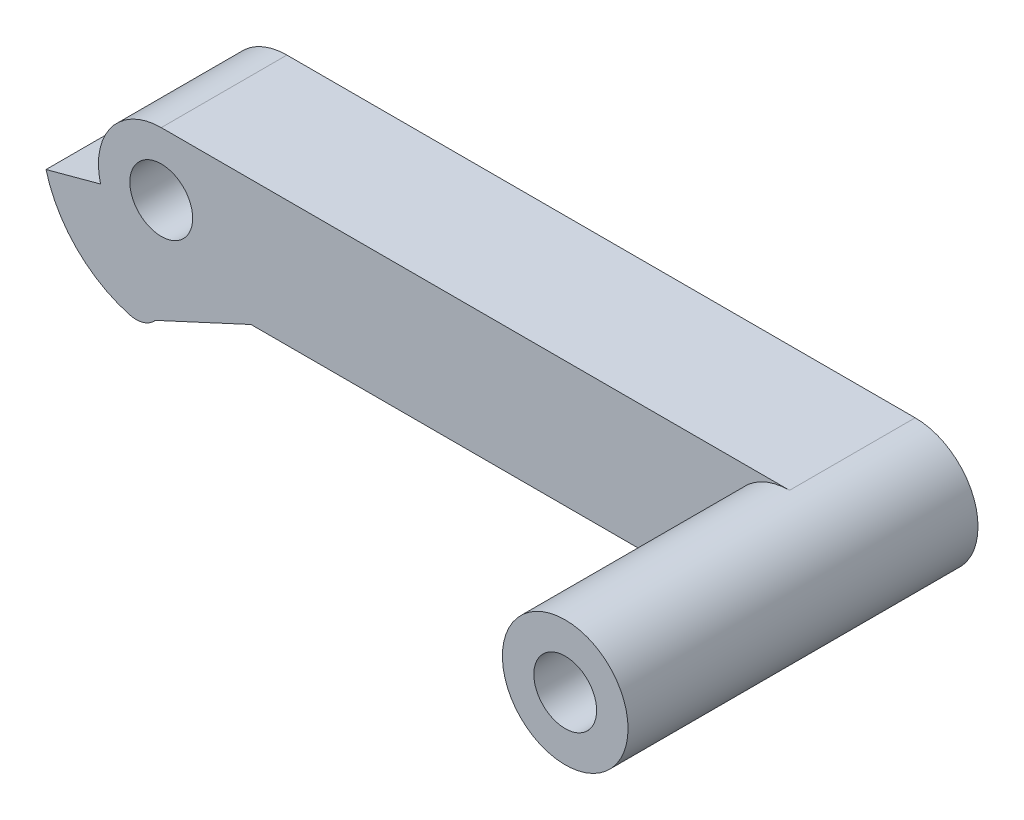
ISO-10303-21;
HEADER;
FILE_DESCRIPTION(('STEP AP214'),'2;1');
FILE_NAME('part.step','',(''),(''),'','','');
FILE_SCHEMA(('AUTOMOTIVE_DESIGN { 1 0 10303 214 1 1 1 1 }'));
ENDSEC;
DATA;
#1=APPLICATION_CONTEXT('core data for automotive mechanical design processes');
#2=APPLICATION_PROTOCOL_DEFINITION('international standard','automotive_design',2000,#1);
#3=PRODUCT_CONTEXT('',#1,'mechanical');
#4=PRODUCT('Part','Part','',(#3));
#5=PRODUCT_RELATED_PRODUCT_CATEGORY('part','',(#4));
#6=PRODUCT_DEFINITION_FORMATION('','',#4);
#7=PRODUCT_DEFINITION_CONTEXT('part definition',#1,'design');
#8=PRODUCT_DEFINITION('design','',#6,#7);
#9=PRODUCT_DEFINITION_SHAPE('','',#8);
#10=(LENGTH_UNIT() NAMED_UNIT(*) SI_UNIT(.MILLI.,.METRE.));
#11=(NAMED_UNIT(*) PLANE_ANGLE_UNIT() SI_UNIT($,.RADIAN.));
#12=(NAMED_UNIT(*) SI_UNIT($,.STERADIAN.) SOLID_ANGLE_UNIT());
#13=UNCERTAINTY_MEASURE_WITH_UNIT(LENGTH_MEASURE(1.E-05),#10,'distance_accuracy_value','');
#14=(GEOMETRIC_REPRESENTATION_CONTEXT(3) GLOBAL_UNCERTAINTY_ASSIGNED_CONTEXT((#13)) GLOBAL_UNIT_ASSIGNED_CONTEXT((#10,
#11,#12)) REPRESENTATION_CONTEXT('',''));
#15=CARTESIAN_POINT('',(0.,0.,0.));
#16=DIRECTION('',(0.,0.,1.));
#17=DIRECTION('',(1.,0.,0.));
#18=AXIS2_PLACEMENT_3D('',#15,#16,#17);
#19=CARTESIAN_POINT('',(0.,0.,-12.3012954674884));
#20=DIRECTION('',(0.,0.,1.));
#21=DIRECTION('',(1.,0.,0.));
#22=AXIS2_PLACEMENT_3D('',#19,#20,#21);
#23=CYLINDRICAL_SURFACE('',#22,9.5);
#24=CARTESIAN_POINT('',(0.,0.,10.));
#25=DIRECTION('',(0.,0.,1.));
#26=DIRECTION('',(1.,0.,0.));
#27=AXIS2_PLACEMENT_3D('',#24,#25,#26);
#28=CIRCLE('',#27,9.5);
#29=CARTESIAN_POINT('',(-9.17194693313327,-2.47495241485308,10.));
#30=VERTEX_POINT('',#29);
#31=CARTESIAN_POINT('',(-2.53333333333323,-9.1559937867073,10.));
#32=VERTEX_POINT('',#31);
#33=EDGE_CURVE('E121',#30,#32,#28,.T.);
#34=ORIENTED_EDGE('',*,*,#33,.F.);
#35=DIRECTION('',(0.,0.,1.));
#36=VECTOR('',#35,1.);
#37=CARTESIAN_POINT('',(-9.17194693313327,-2.47495241485308,-12.3012954674884));
#38=LINE('',#37,#36);
#39=CARTESIAN_POINT('',(-9.17194693313327,-2.47495241485308,0.));
#40=VERTEX_POINT('',#39);
#41=EDGE_CURVE('E106',#40,#30,#38,.T.);
#42=ORIENTED_EDGE('',*,*,#41,.F.);
#43=CARTESIAN_POINT('',(0.,0.,0.));
#44=DIRECTION('',(0.,0.,1.));
#45=DIRECTION('',(1.,0.,0.));
#46=AXIS2_PLACEMENT_3D('',#43,#44,#45);
#47=CIRCLE('',#46,9.5);
#48=CARTESIAN_POINT('',(-2.53333333333323,-9.1559937867073,0.));
#49=VERTEX_POINT('',#48);
#50=EDGE_CURVE('E116',#49,#40,#47,.F.);
#51=ORIENTED_EDGE('',*,*,#50,.F.);
#52=DIRECTION('',(0.,0.,1.));
#53=VECTOR('',#52,1.);
#54=CARTESIAN_POINT('',(-2.53333333333324,-9.1559937867073,-12.3012954674884));
#55=LINE('',#54,#53);
#56=EDGE_CURVE('E123',#49,#32,#55,.T.);
#57=ORIENTED_EDGE('',*,*,#56,.T.);
#58=EDGE_LOOP('',(#34,#42,#51,#57));
#59=FACE_BOUND('',#58,.T.);
#60=ADVANCED_FACE('F41',(#59),#23,.T.);
#61=CARTESIAN_POINT('',(0.,-5.,10.));
#62=DIRECTION('',(0.,1.,0.));
#63=DIRECTION('',(-1.,0.,0.));
#64=AXIS2_PLACEMENT_3D('',#61,#62,#63);
#65=PLANE('',#64);
#66=DIRECTION('',(1.,0.,0.));
#67=VECTOR('',#66,1.);
#68=CARTESIAN_POINT('',(0.,-5.,10.));
#69=LINE('',#68,#67);
#70=CARTESIAN_POINT('',(7.14343941971596,-5.,10.));
#71=VERTEX_POINT('',#70);
#72=CARTESIAN_POINT('',(50.,-5.,10.));
#73=VERTEX_POINT('',#72);
#74=EDGE_CURVE('E161',#71,#73,#69,.T.);
#75=ORIENTED_EDGE('',*,*,#74,.F.);
#76=DIRECTION('',(0.,0.,-1.));
#77=VECTOR('',#76,1.);
#78=CARTESIAN_POINT('',(7.14343941971596,-5.,10.));
#79=LINE('',#78,#77);
#80=CARTESIAN_POINT('',(7.14343941971596,-5.,0.));
#81=VERTEX_POINT('',#80);
#82=EDGE_CURVE('E187',#71,#81,#79,.T.);
#83=ORIENTED_EDGE('',*,*,#82,.T.);
#84=DIRECTION('',(1.,0.,0.));
#85=VECTOR('',#84,1.);
#86=CARTESIAN_POINT('',(0.,-5.,0.));
#87=LINE('',#86,#85);
#88=CARTESIAN_POINT('',(50.,-5.,0.));
#89=VERTEX_POINT('',#88);
#90=EDGE_CURVE('E152',#81,#89,#87,.T.);
#91=ORIENTED_EDGE('',*,*,#90,.T.);
#92=DIRECTION('',(0.,0.,-1.));
#93=VECTOR('',#92,1.);
#94=CARTESIAN_POINT('',(50.,-5.,10.));
#95=LINE('',#94,#93);
#96=EDGE_CURVE('E179',#73,#89,#95,.T.);
#97=ORIENTED_EDGE('',*,*,#96,.F.);
#98=EDGE_LOOP('',(#75,#83,#91,#97));
#99=FACE_BOUND('',#98,.T.);
#100=ADVANCED_FACE('F194',(#99),#65,.F.);
#101=CARTESIAN_POINT('',(50.,0.,10.));
#102=DIRECTION('',(0.,0.,-1.));
#103=DIRECTION('',(-1.,0.,0.));
#104=AXIS2_PLACEMENT_3D('',#101,#102,#103);
#105=CYLINDRICAL_SURFACE('',#104,5.);
#106=CARTESIAN_POINT('',(50.,0.,0.));
#107=DIRECTION('',(0.,0.,1.));
#108=DIRECTION('',(1.,0.,0.));
#109=AXIS2_PLACEMENT_3D('',#106,#107,#108);
#110=CIRCLE('',#109,5.);
#111=CARTESIAN_POINT('',(50.,5.,0.));
#112=VERTEX_POINT('',#111);
#113=EDGE_CURVE('E169',#89,#112,#110,.T.);
#114=ORIENTED_EDGE('',*,*,#113,.T.);
#115=DIRECTION('',(0.,0.,-1.));
#116=VECTOR('',#115,1.);
#117=CARTESIAN_POINT('',(50.,5.,10.));
#118=LINE('',#117,#116);
#119=CARTESIAN_POINT('',(50.,5.,10.));
#120=VERTEX_POINT('',#119);
#121=EDGE_CURVE('E177',#120,#112,#118,.T.);
#122=ORIENTED_EDGE('',*,*,#121,.F.);
#123=CARTESIAN_POINT('',(50.,0.,10.));
#124=DIRECTION('',(0.,0.,1.));
#125=DIRECTION('',(1.,0.,0.));
#126=AXIS2_PLACEMENT_3D('',#123,#124,#125);
#127=CIRCLE('',#126,5.);
#128=EDGE_CURVE('E142',#120,#73,#127,.T.);
#129=ORIENTED_EDGE('',*,*,#128,.T.);
#130=ORIENTED_EDGE('',*,*,#96,.T.);
#131=EDGE_LOOP('',(#114,#122,#129,#130));
#132=FACE_BOUND('',#131,.T.);
#133=CARTESIAN_POINT('',(50.,0.,27.85));
#134=DIRECTION('',(0.,0.,1.));
#135=DIRECTION('',(1.,0.,0.));
#136=AXIS2_PLACEMENT_3D('',#133,#134,#135);
#137=CIRCLE('',#136,5.);
#138=CARTESIAN_POINT('',(55.,0.,27.85));
#139=VERTEX_POINT('',#138);
#140=EDGE_CURVE('E143',#139,#139,#137,.T.);
#141=ORIENTED_EDGE('',*,*,#140,.F.);
#142=EDGE_LOOP('',(#141));
#143=FACE_BOUND('',#142,.T.);
#144=ADVANCED_FACE('F204',(#132,#143),#105,.T.);
#145=CARTESIAN_POINT('',(0.,5.,10.));
#146=DIRECTION('',(0.,1.,0.));
#147=DIRECTION('',(-1.,0.,0.));
#148=AXIS2_PLACEMENT_3D('',#145,#146,#147);
#149=PLANE('',#148);
#150=DIRECTION('',(1.,0.,0.));
#151=VECTOR('',#150,1.);
#152=CARTESIAN_POINT('',(0.,5.,0.));
#153=LINE('',#152,#151);
#154=CARTESIAN_POINT('',(0.,5.,0.));
#155=VERTEX_POINT('',#154);
#156=EDGE_CURVE('E172',#155,#112,#153,.T.);
#157=ORIENTED_EDGE('',*,*,#156,.F.);
#158=DIRECTION('',(0.,0.,-1.));
#159=VECTOR('',#158,1.);
#160=CARTESIAN_POINT('',(0.,5.,10.));
#161=LINE('',#160,#159);
#162=CARTESIAN_POINT('',(0.,5.,10.));
#163=VERTEX_POINT('',#162);
#164=EDGE_CURVE('E167',#163,#155,#161,.T.);
#165=ORIENTED_EDGE('',*,*,#164,.F.);
#166=DIRECTION('',(1.,0.,0.));
#167=VECTOR('',#166,1.);
#168=CARTESIAN_POINT('',(0.,5.,10.));
#169=LINE('',#168,#167);
#170=EDGE_CURVE('E163',#163,#120,#169,.T.);
#171=ORIENTED_EDGE('',*,*,#170,.T.);
#172=ORIENTED_EDGE('',*,*,#121,.T.);
#173=EDGE_LOOP('',(#157,#165,#171,#172));
#174=FACE_BOUND('',#173,.T.);
#175=ADVANCED_FACE('F251',(#174),#149,.T.);
#176=CARTESIAN_POINT('',(0.,0.,10.));
#177=DIRECTION('',(0.,0.,-1.));
#178=DIRECTION('',(-1.,0.,0.));
#179=AXIS2_PLACEMENT_3D('',#176,#177,#178);
#180=CYLINDRICAL_SURFACE('',#179,5.);
#181=DIRECTION('',(0.,0.,1.));
#182=VECTOR('',#181,1.);
#183=CARTESIAN_POINT('',(-4.82734049112278,-1.3026065341332,-12.3012954674884));
#184=LINE('',#183,#182);
#185=CARTESIAN_POINT('',(-4.82734049112278,-1.3026065341332,0.));
#186=VERTEX_POINT('',#185);
#187=CARTESIAN_POINT('',(-4.82734049112278,-1.3026065341332,10.));
#188=VERTEX_POINT('',#187);
#189=EDGE_CURVE('E117',#186,#188,#184,.T.);
#190=ORIENTED_EDGE('',*,*,#189,.T.);
#191=CARTESIAN_POINT('',(0.,0.,10.));
#192=DIRECTION('',(0.,0.,1.));
#193=DIRECTION('',(1.,0.,0.));
#194=AXIS2_PLACEMENT_3D('',#191,#192,#193);
#195=CIRCLE('',#194,5.);
#196=EDGE_CURVE('E131',#163,#188,#195,.T.);
#197=ORIENTED_EDGE('',*,*,#196,.F.);
#198=ORIENTED_EDGE('',*,*,#164,.T.);
#199=CARTESIAN_POINT('',(0.,0.,0.));
#200=DIRECTION('',(0.,0.,1.));
#201=DIRECTION('',(1.,0.,0.));
#202=AXIS2_PLACEMENT_3D('',#199,#200,#201);
#203=CIRCLE('',#202,5.);
#204=EDGE_CURVE('E164',#155,#186,#203,.T.);
#205=ORIENTED_EDGE('',*,*,#204,.T.);
#206=EDGE_LOOP('',(#190,#197,#198,#205));
#207=FACE_BOUND('',#206,.T.);
#208=ADVANCED_FACE('F245',(#207),#180,.T.);
#209=CARTESIAN_POINT('',(0.,0.,10.));
#210=DIRECTION('',(0.,0.,1.));
#211=DIRECTION('',(1.,0.,0.));
#212=AXIS2_PLACEMENT_3D('',#209,#210,#211);
#213=PLANE('',#212);
#214=ORIENTED_EDGE('',*,*,#33,.T.);
#215=CARTESIAN_POINT('',(-1.99999999999992,-7.2284161474005,10.));
#216=DIRECTION('',(0.,0.,1.));
#217=DIRECTION('',(1.,0.,0.));
#218=AXIS2_PLACEMENT_3D('',#215,#216,#217);
#219=CIRCLE('',#218,2.);
#220=CARTESIAN_POINT('',(-0.476093430047268,-8.52368012283375,10.));
#221=VERTEX_POINT('',#220);
#222=EDGE_CURVE('E183',#32,#221,#219,.T.);
#223=ORIENTED_EDGE('',*,*,#222,.T.);
#224=DIRECTION('',(-0.907643098281649,-0.419742785693439,0.));
#225=VECTOR('',#224,1.);
#226=CARTESIAN_POINT('',(7.14343941971596,-5.,10.));
#227=LINE('',#226,#225);
#228=EDGE_CURVE('E14',#221,#71,#227,.F.);
#229=ORIENTED_EDGE('',*,*,#228,.T.);
#230=ORIENTED_EDGE('',*,*,#74,.T.);
#231=ORIENTED_EDGE('',*,*,#128,.F.);
#232=ORIENTED_EDGE('',*,*,#170,.F.);
#233=ORIENTED_EDGE('',*,*,#196,.T.);
#234=DIRECTION('',(-0.965468098224555,-0.260521306826641,0.));
#235=VECTOR('',#234,1.);
#236=CARTESIAN_POINT('',(-9.17194693313327,-2.47495241485309,10.));
#237=LINE('',#236,#235);
#238=EDGE_CURVE('E111',#188,#30,#237,.T.);
#239=ORIENTED_EDGE('',*,*,#238,.T.);
#240=EDGE_LOOP('',(#214,#223,#229,#230,#231,#232,#233,#239));
#241=FACE_BOUND('',#240,.T.);
#242=CARTESIAN_POINT('',(0.,0.,10.));
#243=DIRECTION('',(0.,0.,1.));
#244=DIRECTION('',(1.,0.,0.));
#245=AXIS2_PLACEMENT_3D('',#242,#243,#244);
#246=CIRCLE('',#245,2.5);
#247=CARTESIAN_POINT('',(2.5,0.,10.));
#248=VERTEX_POINT('',#247);
#249=EDGE_CURVE('E156',#248,#248,#246,.T.);
#250=ORIENTED_EDGE('',*,*,#249,.F.);
#251=EDGE_LOOP('',(#250));
#252=FACE_BOUND('',#251,.T.);
#253=ADVANCED_FACE('F127',(#241,#252),#213,.T.);
#254=CARTESIAN_POINT('',(0.,0.,0.));
#255=DIRECTION('',(0.,0.,1.));
#256=DIRECTION('',(1.,0.,0.));
#257=AXIS2_PLACEMENT_3D('',#254,#255,#256);
#258=PLANE('',#257);
#259=CARTESIAN_POINT('',(50.,0.,0.));
#260=DIRECTION('',(0.,0.,1.));
#261=DIRECTION('',(1.,0.,0.));
#262=AXIS2_PLACEMENT_3D('',#259,#260,#261);
#263=CIRCLE('',#262,2.5);
#264=CARTESIAN_POINT('',(52.5,0.,0.));
#265=VERTEX_POINT('',#264);
#266=EDGE_CURVE('E149',#265,#265,#263,.T.);
#267=ORIENTED_EDGE('',*,*,#266,.T.);
#268=EDGE_LOOP('',(#267));
#269=FACE_BOUND('',#268,.T.);
#270=CARTESIAN_POINT('',(0.,0.,0.));
#271=DIRECTION('',(0.,0.,1.));
#272=DIRECTION('',(1.,0.,0.));
#273=AXIS2_PLACEMENT_3D('',#270,#271,#272);
#274=CIRCLE('',#273,2.5);
#275=CARTESIAN_POINT('',(2.5,0.,0.));
#276=VERTEX_POINT('',#275);
#277=EDGE_CURVE('E153',#276,#276,#274,.T.);
#278=ORIENTED_EDGE('',*,*,#277,.T.);
#279=EDGE_LOOP('',(#278));
#280=FACE_BOUND('',#279,.T.);
#281=ORIENTED_EDGE('',*,*,#90,.F.);
#282=DIRECTION('',(0.907643098281649,0.419742785693439,0.));
#283=VECTOR('',#282,1.);
#284=CARTESIAN_POINT('',(3.16344298703683,-6.84056353523254,0.));
#285=LINE('',#284,#283);
#286=CARTESIAN_POINT('',(-0.476093430047268,-8.52368012283375,0.));
#287=VERTEX_POINT('',#286);
#288=EDGE_CURVE('E50',#81,#287,#285,.F.);
#289=ORIENTED_EDGE('',*,*,#288,.T.);
#290=CARTESIAN_POINT('',(-1.99999999999992,-7.2284161474005,0.));
#291=DIRECTION('',(0.,0.,1.));
#292=DIRECTION('',(1.,0.,0.));
#293=AXIS2_PLACEMENT_3D('',#290,#291,#292);
#294=CIRCLE('',#293,2.);
#295=EDGE_CURVE('E185',#287,#49,#294,.F.);
#296=ORIENTED_EDGE('',*,*,#295,.T.);
#297=ORIENTED_EDGE('',*,*,#50,.T.);
#298=DIRECTION('',(0.965468098224555,0.260521306826641,0.));
#299=VECTOR('',#298,1.);
#300=CARTESIAN_POINT('',(-9.17194693313327,-2.47495241485309,0.));
#301=LINE('',#300,#299);
#302=EDGE_CURVE('E113',#40,#186,#301,.T.);
#303=ORIENTED_EDGE('',*,*,#302,.T.);
#304=ORIENTED_EDGE('',*,*,#204,.F.);
#305=ORIENTED_EDGE('',*,*,#156,.T.);
#306=ORIENTED_EDGE('',*,*,#113,.F.);
#307=EDGE_LOOP('',(#281,#289,#296,#297,#303,#304,#305,#306));
#308=FACE_BOUND('',#307,.T.);
#309=ADVANCED_FACE('F199',(#269,#280,#308),#258,.F.);
#310=CARTESIAN_POINT('',(0.,0.,0.));
#311=DIRECTION('',(0.,0.,1.));
#312=DIRECTION('',(1.,0.,0.));
#313=AXIS2_PLACEMENT_3D('',#310,#311,#312);
#314=CYLINDRICAL_SURFACE('',#313,2.5);
#315=ORIENTED_EDGE('',*,*,#277,.F.);
#316=EDGE_LOOP('',(#315));
#317=FACE_BOUND('',#316,.T.);
#318=ORIENTED_EDGE('',*,*,#249,.T.);
#319=EDGE_LOOP('',(#318));
#320=FACE_BOUND('',#319,.T.);
#321=ADVANCED_FACE('F238',(#317,#320),#314,.F.);
#322=CARTESIAN_POINT('',(50.,0.,0.));
#323=DIRECTION('',(0.,0.,1.));
#324=DIRECTION('',(1.,0.,0.));
#325=AXIS2_PLACEMENT_3D('',#322,#323,#324);
#326=CYLINDRICAL_SURFACE('',#325,2.5);
#327=ORIENTED_EDGE('',*,*,#266,.F.);
#328=EDGE_LOOP('',(#327));
#329=FACE_BOUND('',#328,.T.);
#330=CARTESIAN_POINT('',(50.,0.,10.));
#331=DIRECTION('',(0.,0.,1.));
#332=DIRECTION('',(1.,0.,0.));
#333=AXIS2_PLACEMENT_3D('',#330,#331,#332);
#334=CIRCLE('',#333,2.5);
#335=CARTESIAN_POINT('',(52.5,0.,10.));
#336=VERTEX_POINT('',#335);
#337=EDGE_CURVE('E146',#336,#336,#334,.T.);
#338=ORIENTED_EDGE('',*,*,#337,.T.);
#339=EDGE_LOOP('',(#338));
#340=FACE_BOUND('',#339,.T.);
#341=ADVANCED_FACE('F231',(#329,#340),#326,.F.);
#342=CARTESIAN_POINT('',(50.,0.,27.85));
#343=DIRECTION('',(0.,0.,1.));
#344=DIRECTION('',(1.,0.,0.));
#345=AXIS2_PLACEMENT_3D('',#342,#343,#344);
#346=PLANE('',#345);
#347=CARTESIAN_POINT('',(50.,0.,27.85));
#348=DIRECTION('',(0.,0.,1.));
#349=DIRECTION('',(1.,0.,0.));
#350=AXIS2_PLACEMENT_3D('',#347,#348,#349);
#351=CIRCLE('',#350,2.5);
#352=CARTESIAN_POINT('',(52.5,0.,27.85));
#353=VERTEX_POINT('',#352);
#354=EDGE_CURVE('E135',#353,#353,#351,.T.);
#355=ORIENTED_EDGE('',*,*,#354,.F.);
#356=EDGE_LOOP('',(#355));
#357=FACE_BOUND('',#356,.T.);
#358=ORIENTED_EDGE('',*,*,#140,.T.);
#359=EDGE_LOOP('',(#358));
#360=FACE_BOUND('',#359,.T.);
#361=ADVANCED_FACE('F228',(#357,#360),#346,.T.);
#362=CARTESIAN_POINT('',(50.,0.,10.));
#363=DIRECTION('',(0.,0.,1.));
#364=DIRECTION('',(1.,0.,0.));
#365=AXIS2_PLACEMENT_3D('',#362,#363,#364);
#366=PLANE('',#365);
#367=CARTESIAN_POINT('',(50.,0.,10.));
#368=DIRECTION('',(0.,0.,1.));
#369=DIRECTION('',(1.,0.,0.));
#370=AXIS2_PLACEMENT_3D('',#367,#368,#369);
#371=CIRCLE('',#370,1.75);
#372=CARTESIAN_POINT('',(51.75,0.,10.));
#373=VERTEX_POINT('',#372);
#374=EDGE_CURVE('E45',#373,#373,#371,.T.);
#375=ORIENTED_EDGE('',*,*,#374,.T.);
#376=EDGE_LOOP('',(#375));
#377=FACE_BOUND('',#376,.T.);
#378=ORIENTED_EDGE('',*,*,#337,.F.);
#379=EDGE_LOOP('',(#378));
#380=FACE_BOUND('',#379,.T.);
#381=ADVANCED_FACE('F227',(#377,#380),#366,.F.);
#382=CARTESIAN_POINT('',(-9.17194693313327,-2.47495241485309,-12.3012954674884));
#383=DIRECTION('',(-0.260521306826641,0.965468098224555,0.));
#384=DIRECTION('',(-0.965468098224555,-0.260521306826641,0.));
#385=AXIS2_PLACEMENT_3D('',#382,#383,#384);
#386=PLANE('',#385);
#387=ORIENTED_EDGE('',*,*,#41,.T.);
#388=ORIENTED_EDGE('',*,*,#238,.F.);
#389=ORIENTED_EDGE('',*,*,#189,.F.);
#390=ORIENTED_EDGE('',*,*,#302,.F.);
#391=EDGE_LOOP('',(#387,#388,#389,#390));
#392=FACE_BOUND('',#391,.T.);
#393=ADVANCED_FACE('F108',(#392),#386,.T.);
#394=CARTESIAN_POINT('',(-1.99999999999992,-7.2284161474005,-12.3012954674884));
#395=DIRECTION('',(0.,0.,1.));
#396=DIRECTION('',(1.,0.,0.));
#397=AXIS2_PLACEMENT_3D('',#394,#395,#396);
#398=CYLINDRICAL_SURFACE('',#397,2.);
#399=ORIENTED_EDGE('',*,*,#295,.F.);
#400=DIRECTION('',(0.,0.,1.));
#401=VECTOR('',#400,1.);
#402=CARTESIAN_POINT('',(-0.476093430047268,-8.52368012283375,-12.3012954674884));
#403=LINE('',#402,#401);
#404=EDGE_CURVE('E57',#287,#221,#403,.T.);
#405=ORIENTED_EDGE('',*,*,#404,.T.);
#406=ORIENTED_EDGE('',*,*,#222,.F.);
#407=ORIENTED_EDGE('',*,*,#56,.F.);
#408=EDGE_LOOP('',(#399,#405,#406,#407));
#409=FACE_BOUND('',#408,.T.);
#410=ADVANCED_FACE('F209',(#409),#398,.T.);
#411=CARTESIAN_POINT('',(7.14343941971596,-5.,-12.3012954674884));
#412=DIRECTION('',(0.419742785693439,-0.907643098281649,0.));
#413=DIRECTION('',(0.,0.,1.));
#414=AXIS2_PLACEMENT_3D('',#411,#412,#413);
#415=PLANE('',#414);
#416=ORIENTED_EDGE('',*,*,#228,.F.);
#417=ORIENTED_EDGE('',*,*,#404,.F.);
#418=ORIENTED_EDGE('',*,*,#288,.F.);
#419=ORIENTED_EDGE('',*,*,#82,.F.);
#420=EDGE_LOOP('',(#416,#417,#418,#419));
#421=FACE_BOUND('',#420,.T.);
#422=ADVANCED_FACE('F43',(#421),#415,.T.);
#423=CARTESIAN_POINT('',(50.,0.,19.85));
#424=DIRECTION('',(0.,0.,1.));
#425=DIRECTION('',(1.,0.,0.));
#426=AXIS2_PLACEMENT_3D('',#423,#424,#425);
#427=CYLINDRICAL_SURFACE('',#426,2.5);
#428=CARTESIAN_POINT('',(50.,0.,19.85));
#429=DIRECTION('',(0.,0.,1.));
#430=DIRECTION('',(1.,0.,0.));
#431=AXIS2_PLACEMENT_3D('',#428,#429,#430);
#432=CIRCLE('',#431,2.5);
#433=CARTESIAN_POINT('',(52.5,0.,19.85));
#434=VERTEX_POINT('',#433);
#435=EDGE_CURVE('E132',#434,#434,#432,.T.);
#436=ORIENTED_EDGE('',*,*,#435,.F.);
#437=EDGE_LOOP('',(#436));
#438=FACE_BOUND('',#437,.T.);
#439=ORIENTED_EDGE('',*,*,#354,.T.);
#440=EDGE_LOOP('',(#439));
#441=FACE_BOUND('',#440,.T.);
#442=ADVANCED_FACE('F208',(#438,#441),#427,.F.);
#443=CARTESIAN_POINT('',(50.,0.,19.85));
#444=DIRECTION('',(0.,0.,1.));
#445=DIRECTION('',(1.,0.,0.));
#446=AXIS2_PLACEMENT_3D('',#443,#444,#445);
#447=PLANE('',#446);
#448=CARTESIAN_POINT('',(50.,0.,19.85));
#449=DIRECTION('',(0.,0.,1.));
#450=DIRECTION('',(1.,0.,0.));
#451=AXIS2_PLACEMENT_3D('',#448,#449,#450);
#452=CIRCLE('',#451,1.75);
#453=CARTESIAN_POINT('',(51.75,0.,19.85));
#454=VERTEX_POINT('',#453);
#455=EDGE_CURVE('E406',#454,#454,#452,.T.);
#456=ORIENTED_EDGE('',*,*,#455,.F.);
#457=EDGE_LOOP('',(#456));
#458=FACE_BOUND('',#457,.T.);
#459=ORIENTED_EDGE('',*,*,#435,.T.);
#460=EDGE_LOOP('',(#459));
#461=FACE_BOUND('',#460,.T.);
#462=ADVANCED_FACE('F214',(#458,#461),#447,.T.);
#463=CARTESIAN_POINT('',(50.,0.,5.05025253169416));
#464=DIRECTION('',(0.,0.,1.));
#465=DIRECTION('',(1.,0.,0.));
#466=AXIS2_PLACEMENT_3D('',#463,#464,#465);
#467=CYLINDRICAL_SURFACE('',#466,1.75);
#468=ORIENTED_EDGE('',*,*,#455,.T.);
#469=EDGE_LOOP('',(#468));
#470=FACE_BOUND('',#469,.T.);
#471=ORIENTED_EDGE('',*,*,#374,.F.);
#472=EDGE_LOOP('',(#471));
#473=FACE_BOUND('',#472,.T.);
#474=ADVANCED_FACE('F322',(#470,#473),#467,.F.);
#475=CLOSED_SHELL('',(#60,#100,#144,#175,#208,#253,#309,#321,#341,#361,#381,#393,#410,#422,#442,
#462,#474));
#476=MANIFOLD_SOLID_BREP('B2',#475);
#477=ADVANCED_BREP_SHAPE_REPRESENTATION('',(#18,#476),#14);
#478=SHAPE_DEFINITION_REPRESENTATION(#9,#477);
ENDSEC;
END-ISO-10303-21;
